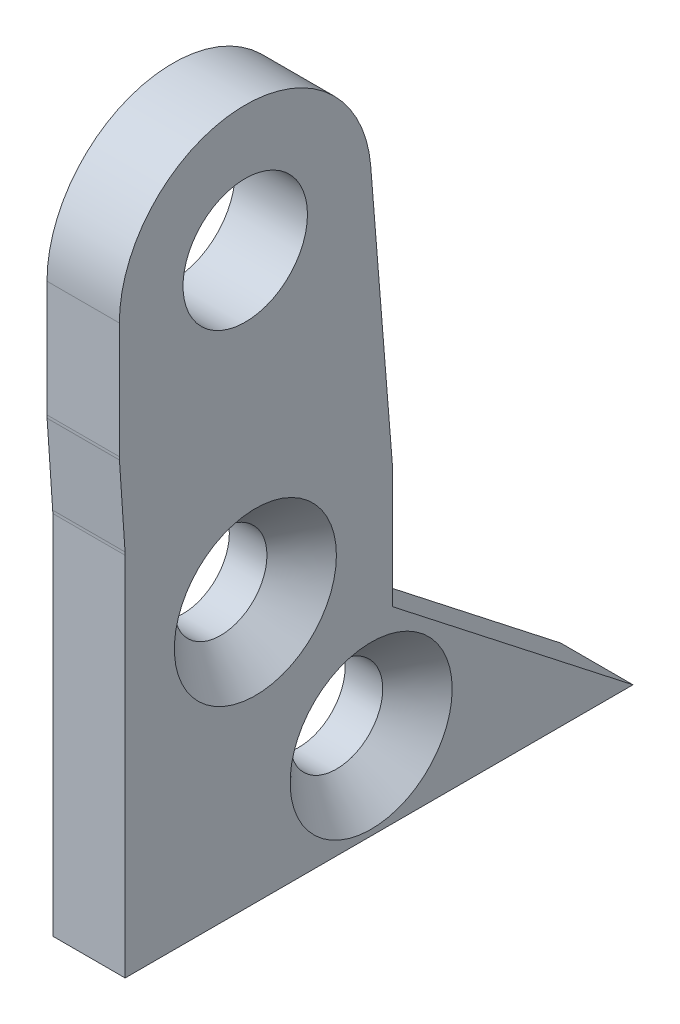
ISO-10303-21;
HEADER;
FILE_DESCRIPTION(('STEP AP214'),'2;1');
FILE_NAME('part.step','',(''),(''),'','','');
FILE_SCHEMA(('AUTOMOTIVE_DESIGN { 1 0 10303 214 1 1 1 1 }'));
ENDSEC;
DATA;
#1=APPLICATION_CONTEXT('core data for automotive mechanical design processes');
#2=APPLICATION_PROTOCOL_DEFINITION('international standard','automotive_design',2000,#1);
#3=PRODUCT_CONTEXT('',#1,'mechanical');
#4=PRODUCT('Part','Part','',(#3));
#5=PRODUCT_RELATED_PRODUCT_CATEGORY('part','',(#4));
#6=PRODUCT_DEFINITION_FORMATION('','',#4);
#7=PRODUCT_DEFINITION_CONTEXT('part definition',#1,'design');
#8=PRODUCT_DEFINITION('design','',#6,#7);
#9=PRODUCT_DEFINITION_SHAPE('','',#8);
#10=(LENGTH_UNIT() NAMED_UNIT(*) SI_UNIT(.MILLI.,.METRE.));
#11=(NAMED_UNIT(*) PLANE_ANGLE_UNIT() SI_UNIT($,.RADIAN.));
#12=(NAMED_UNIT(*) SI_UNIT($,.STERADIAN.) SOLID_ANGLE_UNIT());
#13=UNCERTAINTY_MEASURE_WITH_UNIT(LENGTH_MEASURE(1.E-05),#10,'distance_accuracy_value','');
#14=(GEOMETRIC_REPRESENTATION_CONTEXT(3) GLOBAL_UNCERTAINTY_ASSIGNED_CONTEXT((#13)) GLOBAL_UNIT_ASSIGNED_CONTEXT((#10,
#11,#12)) REPRESENTATION_CONTEXT('',''));
#15=CARTESIAN_POINT('',(0.,0.,0.));
#16=DIRECTION('',(0.,0.,1.));
#17=DIRECTION('',(1.,0.,0.));
#18=AXIS2_PLACEMENT_3D('',#15,#16,#17);
#19=CARTESIAN_POINT('',(1.25,0.,0.));
#20=DIRECTION('',(1.,0.,0.));
#21=DIRECTION('',(0.,0.,-1.));
#22=AXIS2_PLACEMENT_3D('',#19,#20,#21);
#23=PLANE('',#22);
#24=CARTESIAN_POINT('',(1.25,-16.7,-4.35));
#25=DIRECTION('',(1.,0.,0.));
#26=DIRECTION('',(0.,0.,-1.));
#27=AXIS2_PLACEMENT_3D('',#24,#25,#26);
#28=CIRCLE('',#27,2.80000000000001);
#29=CARTESIAN_POINT('',(1.25,-16.7,-7.15000000000001));
#30=VERTEX_POINT('',#29);
#31=EDGE_CURVE('E44',#30,#30,#28,.F.);
#32=ORIENTED_EDGE('',*,*,#31,.T.);
#33=EDGE_LOOP('',(#32));
#34=FACE_BOUND('',#33,.T.);
#35=CARTESIAN_POINT('',(1.25,-10.7,-0.35));
#36=DIRECTION('',(1.,0.,0.));
#37=DIRECTION('',(0.,0.,-1.));
#38=AXIS2_PLACEMENT_3D('',#35,#36,#37);
#39=CIRCLE('',#38,2.80000000000001);
#40=CARTESIAN_POINT('',(1.25,-10.7,-3.15000000000001));
#41=VERTEX_POINT('',#40);
#42=EDGE_CURVE('E167',#41,#41,#39,.F.);
#43=ORIENTED_EDGE('',*,*,#42,.T.);
#44=EDGE_LOOP('',(#43));
#45=FACE_BOUND('',#44,.T.);
#46=DIRECTION('',(0.,0.,1.));
#47=VECTOR('',#46,1.);
#48=CARTESIAN_POINT('',(1.25,-19.7,4.15));
#49=LINE('',#48,#47);
#50=CARTESIAN_POINT('',(1.25,-19.7,-13.3978945611621));
#51=VERTEX_POINT('',#50);
#52=CARTESIAN_POINT('',(1.25,-19.7,4.15));
#53=VERTEX_POINT('',#52);
#54=EDGE_CURVE('E196',#51,#53,#49,.T.);
#55=ORIENTED_EDGE('',*,*,#54,.F.);
#56=DIRECTION('',(0.,-0.615661475325654,-0.788010753606726));
#57=VECTOR('',#56,1.);
#58=CARTESIAN_POINT('',(1.25,-19.7,-13.3978945611621));
#59=LINE('',#58,#57);
#60=CARTESIAN_POINT('',(1.25,-13.2060676728955,-5.08604021905647));
#61=VERTEX_POINT('',#60);
#62=EDGE_CURVE('E205',#61,#51,#59,.T.);
#63=ORIENTED_EDGE('',*,*,#62,.F.);
#64=DIRECTION('',(0.,-1.,0.));
#65=VECTOR('',#64,1.);
#66=CARTESIAN_POINT('',(1.25,-13.2060676728955,-5.08604021905647));
#67=LINE('',#66,#65);
#68=CARTESIAN_POINT('',(1.25,-8.98239612653322,-5.08604021905647));
#69=VERTEX_POINT('',#68);
#70=EDGE_CURVE('E191',#69,#61,#67,.T.);
#71=ORIENTED_EDGE('',*,*,#70,.F.);
#72=DIRECTION('',(0.,0.996785052789297,0.0801221475987673));
#73=VECTOR('',#72,1.);
#74=CARTESIAN_POINT('',(1.25,-12.8120622960922,-5.39387095671929));
#75=LINE('',#74,#73);
#76=CARTESIAN_POINT('',(1.25,0.348531342054637,-4.33601497963344));
#77=VERTEX_POINT('',#76);
#78=EDGE_CURVE('E60',#69,#77,#75,.T.);
#79=ORIENTED_EDGE('',*,*,#78,.T.);
#80=CARTESIAN_POINT('',(1.25,0.,0.));
#81=DIRECTION('',(1.,0.,0.));
#82=DIRECTION('',(0.,0.,-1.));
#83=AXIS2_PLACEMENT_3D('',#80,#81,#82);
#84=CIRCLE('',#83,4.35);
#85=CARTESIAN_POINT('',(1.25,0.,4.35));
#86=VERTEX_POINT('',#85);
#87=EDGE_CURVE('E155',#77,#86,#84,.T.);
#88=ORIENTED_EDGE('',*,*,#87,.T.);
#89=DIRECTION('',(0.,-1.,0.));
#90=VECTOR('',#89,1.);
#91=CARTESIAN_POINT('',(1.25,0.,4.35));
#92=LINE('',#91,#90);
#93=CARTESIAN_POINT('',(1.25,-4.,4.35));
#94=VERTEX_POINT('',#93);
#95=EDGE_CURVE('E96',#86,#94,#92,.T.);
#96=ORIENTED_EDGE('',*,*,#95,.T.);
#97=CARTESIAN_POINT('',(1.25,-4.,2.85));
#98=DIRECTION('',(1.,0.,0.));
#99=DIRECTION('',(0.,0.,-1.));
#100=AXIS2_PLACEMENT_3D('',#97,#98,#99);
#101=CIRCLE('',#100,1.5);
#102=CARTESIAN_POINT('',(1.25,-4.1014895015837,4.346562688653));
#103=VERTEX_POINT('',#102);
#104=EDGE_CURVE('E115',#94,#103,#101,.T.);
#105=ORIENTED_EDGE('',*,*,#104,.T.);
#106=DIRECTION('',(0.,-0.997708459101999,-0.0676596677224669));
#107=VECTOR('',#106,1.);
#108=CARTESIAN_POINT('',(1.25,-4.1014895015837,4.346562688653));
#109=LINE('',#108,#107);
#110=CARTESIAN_POINT('',(1.25,-6.94931345773765,4.153437311347));
#111=VERTEX_POINT('',#110);
#112=EDGE_CURVE('E106',#103,#111,#109,.T.);
#113=ORIENTED_EDGE('',*,*,#112,.T.);
#114=CARTESIAN_POINT('',(1.25,-7.05080295932135,5.65));
#115=DIRECTION('',(-1.,0.,0.));
#116=DIRECTION('',(0.,0.,-1.));
#117=AXIS2_PLACEMENT_3D('',#114,#115,#116);
#118=CIRCLE('',#117,1.5);
#119=CARTESIAN_POINT('',(1.25,-7.05080295932135,4.15));
#120=VERTEX_POINT('',#119);
#121=EDGE_CURVE('E112',#111,#120,#118,.T.);
#122=ORIENTED_EDGE('',*,*,#121,.T.);
#123=DIRECTION('',(0.,-1.,0.));
#124=VECTOR('',#123,1.);
#125=CARTESIAN_POINT('',(1.25,-7.05080295932135,4.15));
#126=LINE('',#125,#124);
#127=EDGE_CURVE('E133',#120,#53,#126,.T.);
#128=ORIENTED_EDGE('',*,*,#127,.T.);
#129=EDGE_LOOP('',(#55,#63,#71,#79,#88,#96,#105,#113,#122,#128));
#130=FACE_BOUND('',#129,.T.);
#131=CARTESIAN_POINT('',(1.25,0.,0.));
#132=DIRECTION('',(1.,0.,0.));
#133=DIRECTION('',(0.,0.,-1.));
#134=AXIS2_PLACEMENT_3D('',#131,#132,#133);
#135=CIRCLE('',#134,2.15);
#136=CARTESIAN_POINT('',(1.25,0.,-2.15));
#137=VERTEX_POINT('',#136);
#138=EDGE_CURVE('E144',#137,#137,#135,.T.);
#139=ORIENTED_EDGE('',*,*,#138,.F.);
#140=EDGE_LOOP('',(#139));
#141=FACE_BOUND('',#140,.T.);
#142=ADVANCED_FACE('F36',(#34,#45,#130,#141),#23,.T.);
#143=CARTESIAN_POINT('',(-1.25,0.,0.));
#144=DIRECTION('',(1.,0.,0.));
#145=DIRECTION('',(0.,0.,-1.));
#146=AXIS2_PLACEMENT_3D('',#143,#144,#145);
#147=PLANE('',#146);
#148=CARTESIAN_POINT('',(-1.25,-16.7,-4.35));
#149=DIRECTION('',(1.,0.,0.));
#150=DIRECTION('',(0.,0.,-1.));
#151=AXIS2_PLACEMENT_3D('',#148,#149,#150);
#152=CIRCLE('',#151,1.6);
#153=CARTESIAN_POINT('',(-1.25,-16.7,-5.95));
#154=VERTEX_POINT('',#153);
#155=EDGE_CURVE('E186',#154,#154,#152,.T.);
#156=ORIENTED_EDGE('',*,*,#155,.T.);
#157=EDGE_LOOP('',(#156));
#158=FACE_BOUND('',#157,.T.);
#159=CARTESIAN_POINT('',(-1.25,-10.7,-0.35));
#160=DIRECTION('',(1.,0.,0.));
#161=DIRECTION('',(0.,0.,-1.));
#162=AXIS2_PLACEMENT_3D('',#159,#160,#161);
#163=CIRCLE('',#162,1.6);
#164=CARTESIAN_POINT('',(-1.25,-10.7,-1.95));
#165=VERTEX_POINT('',#164);
#166=EDGE_CURVE('E188',#165,#165,#163,.T.);
#167=ORIENTED_EDGE('',*,*,#166,.T.);
#168=EDGE_LOOP('',(#167));
#169=FACE_BOUND('',#168,.T.);
#170=DIRECTION('',(0.,-0.615661475325654,-0.788010753606726));
#171=VECTOR('',#170,1.);
#172=CARTESIAN_POINT('',(-1.25,-19.7,-13.3978945611621));
#173=LINE('',#172,#171);
#174=CARTESIAN_POINT('',(-1.25,-13.2060676728955,-5.08604021905647));
#175=VERTEX_POINT('',#174);
#176=CARTESIAN_POINT('',(-1.25,-19.7,-13.3978945611621));
#177=VERTEX_POINT('',#176);
#178=EDGE_CURVE('E195',#175,#177,#173,.T.);
#179=ORIENTED_EDGE('',*,*,#178,.T.);
#180=DIRECTION('',(0.,0.,1.));
#181=VECTOR('',#180,1.);
#182=CARTESIAN_POINT('',(-1.25,-19.7,4.15));
#183=LINE('',#182,#181);
#184=CARTESIAN_POINT('',(-1.25,-19.7,4.15));
#185=VERTEX_POINT('',#184);
#186=EDGE_CURVE('E199',#177,#185,#183,.T.);
#187=ORIENTED_EDGE('',*,*,#186,.T.);
#188=DIRECTION('',(0.,-1.,0.));
#189=VECTOR('',#188,1.);
#190=CARTESIAN_POINT('',(-1.25,-7.05080295932135,4.15));
#191=LINE('',#190,#189);
#192=CARTESIAN_POINT('',(-1.25,-7.05080295932135,4.15));
#193=VERTEX_POINT('',#192);
#194=EDGE_CURVE('E151',#193,#185,#191,.T.);
#195=ORIENTED_EDGE('',*,*,#194,.F.);
#196=CARTESIAN_POINT('',(-1.25,-7.05080295932135,5.65));
#197=DIRECTION('',(-1.,0.,0.));
#198=DIRECTION('',(0.,0.,-1.));
#199=AXIS2_PLACEMENT_3D('',#196,#197,#198);
#200=CIRCLE('',#199,1.5);
#201=CARTESIAN_POINT('',(-1.25,-6.94931345773765,4.153437311347));
#202=VERTEX_POINT('',#201);
#203=EDGE_CURVE('E149',#202,#193,#200,.T.);
#204=ORIENTED_EDGE('',*,*,#203,.F.);
#205=DIRECTION('',(0.,-0.997708459101999,-0.0676596677224669));
#206=VECTOR('',#205,1.);
#207=CARTESIAN_POINT('',(-1.25,-4.1014895015837,4.346562688653));
#208=LINE('',#207,#206);
#209=CARTESIAN_POINT('',(-1.25,-4.1014895015837,4.346562688653));
#210=VERTEX_POINT('',#209);
#211=EDGE_CURVE('E124',#210,#202,#208,.T.);
#212=ORIENTED_EDGE('',*,*,#211,.F.);
#213=CARTESIAN_POINT('',(-1.25,-4.,2.85));
#214=DIRECTION('',(1.,0.,0.));
#215=DIRECTION('',(0.,0.,-1.));
#216=AXIS2_PLACEMENT_3D('',#213,#214,#215);
#217=CIRCLE('',#216,1.5);
#218=CARTESIAN_POINT('',(-1.25,-4.,4.35));
#219=VERTEX_POINT('',#218);
#220=EDGE_CURVE('E146',#219,#210,#217,.T.);
#221=ORIENTED_EDGE('',*,*,#220,.F.);
#222=DIRECTION('',(0.,-1.,0.));
#223=VECTOR('',#222,1.);
#224=CARTESIAN_POINT('',(-1.25,0.,4.35));
#225=LINE('',#224,#223);
#226=CARTESIAN_POINT('',(-1.25,0.,4.35));
#227=VERTEX_POINT('',#226);
#228=EDGE_CURVE('E143',#227,#219,#225,.T.);
#229=ORIENTED_EDGE('',*,*,#228,.F.);
#230=CARTESIAN_POINT('',(-1.25,0.,0.));
#231=DIRECTION('',(1.,0.,0.));
#232=DIRECTION('',(0.,0.,-1.));
#233=AXIS2_PLACEMENT_3D('',#230,#231,#232);
#234=CIRCLE('',#233,4.35);
#235=CARTESIAN_POINT('',(-1.25,0.348531342054637,-4.33601497963344));
#236=VERTEX_POINT('',#235);
#237=EDGE_CURVE('E140',#236,#227,#234,.T.);
#238=ORIENTED_EDGE('',*,*,#237,.F.);
#239=DIRECTION('',(0.,0.996785052789297,0.0801221475987673));
#240=VECTOR('',#239,1.);
#241=CARTESIAN_POINT('',(-1.25,-12.8120622960922,-5.39387095671929));
#242=LINE('',#241,#240);
#243=CARTESIAN_POINT('',(-1.25,-8.98239612653322,-5.08604021905647));
#244=VERTEX_POINT('',#243);
#245=EDGE_CURVE('E87',#244,#236,#242,.T.);
#246=ORIENTED_EDGE('',*,*,#245,.F.);
#247=DIRECTION('',(0.,-1.,0.));
#248=VECTOR('',#247,1.);
#249=CARTESIAN_POINT('',(-1.25,-13.2060676728955,-5.08604021905647));
#250=LINE('',#249,#248);
#251=EDGE_CURVE('E51',#244,#175,#250,.T.);
#252=ORIENTED_EDGE('',*,*,#251,.T.);
#253=EDGE_LOOP('',(#179,#187,#195,#204,#212,#221,#229,#238,#246,#252));
#254=FACE_BOUND('',#253,.T.);
#255=CARTESIAN_POINT('',(-1.25,0.,0.));
#256=DIRECTION('',(1.,0.,0.));
#257=DIRECTION('',(0.,0.,-1.));
#258=AXIS2_PLACEMENT_3D('',#255,#256,#257);
#259=CIRCLE('',#258,2.15);
#260=CARTESIAN_POINT('',(-1.25,0.,-2.15));
#261=VERTEX_POINT('',#260);
#262=EDGE_CURVE('E213',#261,#261,#259,.T.);
#263=ORIENTED_EDGE('',*,*,#262,.T.);
#264=EDGE_LOOP('',(#263));
#265=FACE_BOUND('',#264,.T.);
#266=ADVANCED_FACE('F233',(#158,#169,#254,#265),#147,.F.);
#267=CARTESIAN_POINT('',(1.25,0.,0.));
#268=DIRECTION('',(-1.,0.,0.));
#269=DIRECTION('',(0.,0.,1.));
#270=AXIS2_PLACEMENT_3D('',#267,#268,#269);
#271=CYLINDRICAL_SURFACE('',#270,4.35);
#272=ORIENTED_EDGE('',*,*,#237,.T.);
#273=DIRECTION('',(-1.,0.,0.));
#274=VECTOR('',#273,1.);
#275=CARTESIAN_POINT('',(1.25,0.,4.35));
#276=LINE('',#275,#274);
#277=EDGE_CURVE('E162',#86,#227,#276,.T.);
#278=ORIENTED_EDGE('',*,*,#277,.F.);
#279=ORIENTED_EDGE('',*,*,#87,.F.);
#280=DIRECTION('',(-1.,0.,0.));
#281=VECTOR('',#280,1.);
#282=CARTESIAN_POINT('',(1.25,0.348531342054637,-4.33601497963344));
#283=LINE('',#282,#281);
#284=EDGE_CURVE('E139',#77,#236,#283,.T.);
#285=ORIENTED_EDGE('',*,*,#284,.T.);
#286=EDGE_LOOP('',(#272,#278,#279,#285));
#287=FACE_BOUND('',#286,.T.);
#288=ADVANCED_FACE('F259',(#287),#271,.T.);
#289=CARTESIAN_POINT('',(1.25,0.,4.35));
#290=DIRECTION('',(0.,0.,-1.));
#291=DIRECTION('',(0.,1.,0.));
#292=AXIS2_PLACEMENT_3D('',#289,#290,#291);
#293=PLANE('',#292);
#294=ORIENTED_EDGE('',*,*,#228,.T.);
#295=DIRECTION('',(-1.,0.,0.));
#296=VECTOR('',#295,1.);
#297=CARTESIAN_POINT('',(1.25,-4.,4.35));
#298=LINE('',#297,#296);
#299=EDGE_CURVE('E159',#94,#219,#298,.T.);
#300=ORIENTED_EDGE('',*,*,#299,.F.);
#301=ORIENTED_EDGE('',*,*,#95,.F.);
#302=ORIENTED_EDGE('',*,*,#277,.T.);
#303=EDGE_LOOP('',(#294,#300,#301,#302));
#304=FACE_BOUND('',#303,.T.);
#305=ADVANCED_FACE('F228',(#304),#293,.F.);
#306=CARTESIAN_POINT('',(1.25,-4.,2.85));
#307=DIRECTION('',(-1.,0.,0.));
#308=DIRECTION('',(0.,0.,1.));
#309=AXIS2_PLACEMENT_3D('',#306,#307,#308);
#310=CYLINDRICAL_SURFACE('',#309,1.5);
#311=ORIENTED_EDGE('',*,*,#220,.T.);
#312=DIRECTION('',(-1.,0.,0.));
#313=VECTOR('',#312,1.);
#314=CARTESIAN_POINT('',(1.25,-4.1014895015837,4.346562688653));
#315=LINE('',#314,#313);
#316=EDGE_CURVE('E127',#103,#210,#315,.T.);
#317=ORIENTED_EDGE('',*,*,#316,.F.);
#318=ORIENTED_EDGE('',*,*,#104,.F.);
#319=ORIENTED_EDGE('',*,*,#299,.T.);
#320=EDGE_LOOP('',(#311,#317,#318,#319));
#321=FACE_BOUND('',#320,.T.);
#322=ADVANCED_FACE('F231',(#321),#310,.T.);
#323=CARTESIAN_POINT('',(1.25,-4.1014895015837,4.346562688653));
#324=DIRECTION('',(0.,0.0676596677224669,-0.997708459101999));
#325=DIRECTION('',(0.,0.997708459101999,0.0676596677224669));
#326=AXIS2_PLACEMENT_3D('',#323,#324,#325);
#327=PLANE('',#326);
#328=ORIENTED_EDGE('',*,*,#211,.T.);
#329=DIRECTION('',(-1.,0.,0.));
#330=VECTOR('',#329,1.);
#331=CARTESIAN_POINT('',(1.25,-6.94931345773765,4.153437311347));
#332=LINE('',#331,#330);
#333=EDGE_CURVE('E121',#111,#202,#332,.T.);
#334=ORIENTED_EDGE('',*,*,#333,.F.);
#335=ORIENTED_EDGE('',*,*,#112,.F.);
#336=ORIENTED_EDGE('',*,*,#316,.T.);
#337=EDGE_LOOP('',(#328,#334,#335,#336));
#338=FACE_BOUND('',#337,.T.);
#339=ADVANCED_FACE('F122',(#338),#327,.F.);
#340=CARTESIAN_POINT('',(1.25,-7.05080295932135,5.65));
#341=DIRECTION('',(-1.,0.,0.));
#342=DIRECTION('',(0.,0.,1.));
#343=AXIS2_PLACEMENT_3D('',#340,#341,#342);
#344=CYLINDRICAL_SURFACE('',#343,1.5);
#345=ORIENTED_EDGE('',*,*,#203,.T.);
#346=DIRECTION('',(-1.,0.,0.));
#347=VECTOR('',#346,1.);
#348=CARTESIAN_POINT('',(1.25,-7.05080295932135,4.15));
#349=LINE('',#348,#347);
#350=EDGE_CURVE('E128',#120,#193,#349,.T.);
#351=ORIENTED_EDGE('',*,*,#350,.F.);
#352=ORIENTED_EDGE('',*,*,#121,.F.);
#353=ORIENTED_EDGE('',*,*,#333,.T.);
#354=EDGE_LOOP('',(#345,#351,#352,#353));
#355=FACE_BOUND('',#354,.T.);
#356=ADVANCED_FACE('F130',(#355),#344,.F.);
#357=CARTESIAN_POINT('',(1.25,-7.05080295932135,4.15));
#358=DIRECTION('',(0.,0.,-1.));
#359=DIRECTION('',(0.,1.,0.));
#360=AXIS2_PLACEMENT_3D('',#357,#358,#359);
#361=PLANE('',#360);
#362=ORIENTED_EDGE('',*,*,#194,.T.);
#363=DIRECTION('',(1.,0.,0.));
#364=VECTOR('',#363,1.);
#365=CARTESIAN_POINT('',(-1.25,-19.7,4.15));
#366=LINE('',#365,#364);
#367=EDGE_CURVE('E210',#185,#53,#366,.T.);
#368=ORIENTED_EDGE('',*,*,#367,.T.);
#369=ORIENTED_EDGE('',*,*,#127,.F.);
#370=ORIENTED_EDGE('',*,*,#350,.T.);
#371=EDGE_LOOP('',(#362,#368,#369,#370));
#372=FACE_BOUND('',#371,.T.);
#373=ADVANCED_FACE('F237',(#372),#361,.F.);
#374=CARTESIAN_POINT('',(1.25,-12.8120622960922,-5.39387095671929));
#375=DIRECTION('',(0.,-0.0801221475987673,0.996785052789297));
#376=DIRECTION('',(0.,-0.996785052789297,-0.0801221475987673));
#377=AXIS2_PLACEMENT_3D('',#374,#375,#376);
#378=PLANE('',#377);
#379=ORIENTED_EDGE('',*,*,#78,.F.);
#380=DIRECTION('',(1.,0.,0.));
#381=VECTOR('',#380,1.);
#382=CARTESIAN_POINT('',(-1.25,-8.98239612653322,-5.08604021905647));
#383=LINE('',#382,#381);
#384=EDGE_CURVE('E202',#244,#69,#383,.T.);
#385=ORIENTED_EDGE('',*,*,#384,.F.);
#386=ORIENTED_EDGE('',*,*,#245,.T.);
#387=ORIENTED_EDGE('',*,*,#284,.F.);
#388=EDGE_LOOP('',(#379,#385,#386,#387));
#389=FACE_BOUND('',#388,.T.);
#390=ADVANCED_FACE('F260',(#389),#378,.F.);
#391=CARTESIAN_POINT('',(1.25,0.,0.));
#392=DIRECTION('',(-1.,0.,0.));
#393=DIRECTION('',(0.,0.,1.));
#394=AXIS2_PLACEMENT_3D('',#391,#392,#393);
#395=CYLINDRICAL_SURFACE('',#394,2.15);
#396=ORIENTED_EDGE('',*,*,#138,.T.);
#397=EDGE_LOOP('',(#396));
#398=FACE_BOUND('',#397,.T.);
#399=ORIENTED_EDGE('',*,*,#262,.F.);
#400=EDGE_LOOP('',(#399));
#401=FACE_BOUND('',#400,.T.);
#402=ADVANCED_FACE('F278',(#398,#401),#395,.F.);
#403=CARTESIAN_POINT('',(-1.25,-19.7,4.15));
#404=DIRECTION('',(0.,1.,0.));
#405=DIRECTION('',(0.,0.,1.));
#406=AXIS2_PLACEMENT_3D('',#403,#404,#405);
#407=PLANE('',#406);
#408=ORIENTED_EDGE('',*,*,#54,.T.);
#409=ORIENTED_EDGE('',*,*,#367,.F.);
#410=ORIENTED_EDGE('',*,*,#186,.F.);
#411=DIRECTION('',(1.,0.,0.));
#412=VECTOR('',#411,1.);
#413=CARTESIAN_POINT('',(-1.25,-19.7,-13.3978945611621));
#414=LINE('',#413,#412);
#415=EDGE_CURVE('E214',#177,#51,#414,.T.);
#416=ORIENTED_EDGE('',*,*,#415,.T.);
#417=EDGE_LOOP('',(#408,#409,#410,#416));
#418=FACE_BOUND('',#417,.T.);
#419=ADVANCED_FACE('F256',(#418),#407,.F.);
#420=CARTESIAN_POINT('',(-1.25,-19.7,-13.3978945611621));
#421=DIRECTION('',(0.,-0.788010753606726,0.615661475325654));
#422=DIRECTION('',(0.,-0.615661475325654,-0.788010753606726));
#423=AXIS2_PLACEMENT_3D('',#420,#421,#422);
#424=PLANE('',#423);
#425=ORIENTED_EDGE('',*,*,#62,.T.);
#426=ORIENTED_EDGE('',*,*,#415,.F.);
#427=ORIENTED_EDGE('',*,*,#178,.F.);
#428=DIRECTION('',(1.,0.,0.));
#429=VECTOR('',#428,1.);
#430=CARTESIAN_POINT('',(-1.25,-13.2060676728955,-5.08604021905647));
#431=LINE('',#430,#429);
#432=EDGE_CURVE('E217',#175,#61,#431,.T.);
#433=ORIENTED_EDGE('',*,*,#432,.T.);
#434=EDGE_LOOP('',(#425,#426,#427,#433));
#435=FACE_BOUND('',#434,.T.);
#436=ADVANCED_FACE('F255',(#435),#424,.F.);
#437=CARTESIAN_POINT('',(-1.25,-13.2060676728955,-5.08604021905647));
#438=DIRECTION('',(0.,0.,1.));
#439=DIRECTION('',(0.,-1.,0.));
#440=AXIS2_PLACEMENT_3D('',#437,#438,#439);
#441=PLANE('',#440);
#442=ORIENTED_EDGE('',*,*,#70,.T.);
#443=ORIENTED_EDGE('',*,*,#432,.F.);
#444=ORIENTED_EDGE('',*,*,#251,.F.);
#445=ORIENTED_EDGE('',*,*,#384,.T.);
#446=EDGE_LOOP('',(#442,#443,#444,#445));
#447=FACE_BOUND('',#446,.T.);
#448=ADVANCED_FACE('F261',(#447),#441,.F.);
#449=CARTESIAN_POINT('',(-1.25,-10.7,-0.35));
#450=DIRECTION('',(1.,0.,0.));
#451=DIRECTION('',(0.,0.,-1.));
#452=AXIS2_PLACEMENT_3D('',#449,#450,#451);
#453=CYLINDRICAL_SURFACE('',#452,1.6);
#454=CARTESIAN_POINT('',(0.0499999999999986,-10.7,-0.35));
#455=DIRECTION('',(1.,0.,0.));
#456=DIRECTION('',(0.,0.,-1.));
#457=AXIS2_PLACEMENT_3D('',#454,#455,#456);
#458=CIRCLE('',#457,1.6);
#459=CARTESIAN_POINT('',(0.0499999999999986,-10.7,-1.95));
#460=VERTEX_POINT('',#459);
#461=EDGE_CURVE('E11',#460,#460,#458,.T.);
#462=ORIENTED_EDGE('',*,*,#461,.T.);
#463=EDGE_LOOP('',(#462));
#464=FACE_BOUND('',#463,.T.);
#465=ORIENTED_EDGE('',*,*,#166,.F.);
#466=EDGE_LOOP('',(#465));
#467=FACE_BOUND('',#466,.T.);
#468=ADVANCED_FACE('F182',(#464,#467),#453,.F.);
#469=CARTESIAN_POINT('',(-1.25,-16.7,-4.35));
#470=DIRECTION('',(1.,0.,0.));
#471=DIRECTION('',(0.,0.,-1.));
#472=AXIS2_PLACEMENT_3D('',#469,#470,#471);
#473=CYLINDRICAL_SURFACE('',#472,1.6);
#474=CARTESIAN_POINT('',(0.0499999999999993,-16.7,-4.35));
#475=DIRECTION('',(1.,0.,0.));
#476=DIRECTION('',(0.,0.,-1.));
#477=AXIS2_PLACEMENT_3D('',#474,#475,#476);
#478=CIRCLE('',#477,1.6);
#479=CARTESIAN_POINT('',(0.0499999999999993,-16.7,-5.95));
#480=VERTEX_POINT('',#479);
#481=EDGE_CURVE('E164',#480,#480,#478,.T.);
#482=ORIENTED_EDGE('',*,*,#481,.T.);
#483=EDGE_LOOP('',(#482));
#484=FACE_BOUND('',#483,.T.);
#485=ORIENTED_EDGE('',*,*,#155,.F.);
#486=EDGE_LOOP('',(#485));
#487=FACE_BOUND('',#486,.T.);
#488=ADVANCED_FACE('F177',(#484,#487),#473,.F.);
#489=CARTESIAN_POINT('',(0.0499999999999993,-16.7,-4.35));
#490=DIRECTION('',(1.,0.,0.));
#491=DIRECTION('',(0.,0.,-1.));
#492=AXIS2_PLACEMENT_3D('',#489,#490,#491);
#493=CONICAL_SURFACE('',#492,1.6,0.78539816339745);
#494=ORIENTED_EDGE('',*,*,#31,.F.);
#495=EDGE_LOOP('',(#494));
#496=FACE_BOUND('',#495,.T.);
#497=ORIENTED_EDGE('',*,*,#481,.F.);
#498=EDGE_LOOP('',(#497));
#499=FACE_BOUND('',#498,.T.);
#500=ADVANCED_FACE('F174',(#496,#499),#493,.F.);
#501=CARTESIAN_POINT('',(0.0499999999999986,-10.7,-0.35));
#502=DIRECTION('',(1.,0.,0.));
#503=DIRECTION('',(0.,0.,-1.));
#504=AXIS2_PLACEMENT_3D('',#501,#502,#503);
#505=CONICAL_SURFACE('',#504,1.6,0.78539816339745);
#506=ORIENTED_EDGE('',*,*,#42,.F.);
#507=EDGE_LOOP('',(#506));
#508=FACE_BOUND('',#507,.T.);
#509=ORIENTED_EDGE('',*,*,#461,.F.);
#510=EDGE_LOOP('',(#509));
#511=FACE_BOUND('',#510,.T.);
#512=ADVANCED_FACE('F38',(#508,#511),#505,.F.);
#513=CLOSED_SHELL('',(#142,#266,#288,#305,#322,#339,#356,#373,#390,#402,#419,#436,#448,#468,
#488,#500,#512));
#514=MANIFOLD_SOLID_BREP('B2',#513);
#515=ADVANCED_BREP_SHAPE_REPRESENTATION('',(#18,#514),#14);
#516=SHAPE_DEFINITION_REPRESENTATION(#9,#515);
ENDSEC;
END-ISO-10303-21;
